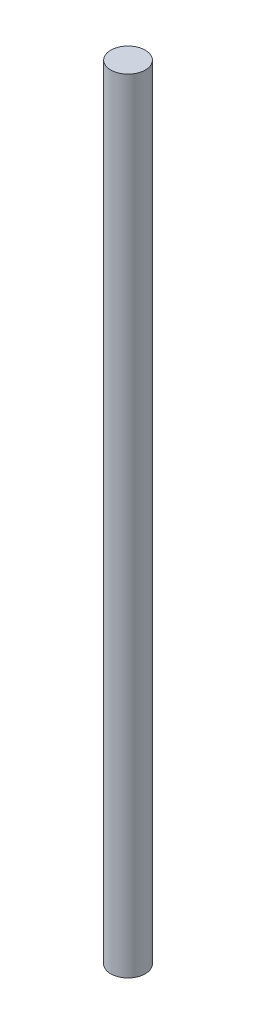
ISO-10303-21;
HEADER;
FILE_DESCRIPTION(('STEP AP214'),'2;1');
FILE_NAME('part.step','',(''),(''),'','','');
FILE_SCHEMA(('AUTOMOTIVE_DESIGN { 1 0 10303 214 1 1 1 1 }'));
ENDSEC;
DATA;
#1=APPLICATION_CONTEXT('core data for automotive mechanical design processes');
#2=APPLICATION_PROTOCOL_DEFINITION('international standard','automotive_design',2000,#1);
#3=PRODUCT_CONTEXT('',#1,'mechanical');
#4=PRODUCT('Part','Part','',(#3));
#5=PRODUCT_RELATED_PRODUCT_CATEGORY('part','',(#4));
#6=PRODUCT_DEFINITION_FORMATION('','',#4);
#7=PRODUCT_DEFINITION_CONTEXT('part definition',#1,'design');
#8=PRODUCT_DEFINITION('design','',#6,#7);
#9=PRODUCT_DEFINITION_SHAPE('','',#8);
#10=(LENGTH_UNIT() NAMED_UNIT(*) SI_UNIT(.MILLI.,.METRE.));
#11=(NAMED_UNIT(*) PLANE_ANGLE_UNIT() SI_UNIT($,.RADIAN.));
#12=(NAMED_UNIT(*) SI_UNIT($,.STERADIAN.) SOLID_ANGLE_UNIT());
#13=UNCERTAINTY_MEASURE_WITH_UNIT(LENGTH_MEASURE(1.E-05),#10,'distance_accuracy_value','');
#14=(GEOMETRIC_REPRESENTATION_CONTEXT(3) GLOBAL_UNCERTAINTY_ASSIGNED_CONTEXT((#13)) GLOBAL_UNIT_ASSIGNED_CONTEXT((#10,
#11,#12)) REPRESENTATION_CONTEXT('',''));
#15=CARTESIAN_POINT('',(0.,0.,0.));
#16=DIRECTION('',(0.,0.,1.));
#17=DIRECTION('',(1.,0.,0.));
#18=AXIS2_PLACEMENT_3D('',#15,#16,#17);
#19=CARTESIAN_POINT('',(0.,0.,0.));
#20=DIRECTION('',(0.,1.,0.));
#21=DIRECTION('',(0.,0.,1.));
#22=AXIS2_PLACEMENT_3D('',#19,#20,#21);
#23=PLANE('',#22);
#24=CARTESIAN_POINT('',(0.,0.,0.));
#25=DIRECTION('',(0.,-1.,0.));
#26=DIRECTION('',(0.,0.,-1.));
#27=AXIS2_PLACEMENT_3D('',#24,#25,#26);
#28=CIRCLE('',#27,1.3);
#29=CARTESIAN_POINT('',(0.,0.,-1.3));
#30=VERTEX_POINT('',#29);
#31=EDGE_CURVE('E10',#30,#30,#28,.T.);
#32=ORIENTED_EDGE('',*,*,#31,.F.);
#33=EDGE_LOOP('',(#32));
#34=FACE_BOUND('',#33,.T.);
#35=ADVANCED_FACE('F31',(#34),#23,.T.);
#36=CARTESIAN_POINT('',(0.,-63.,0.));
#37=DIRECTION('',(0.,-1.,0.));
#38=DIRECTION('',(0.,0.,-1.));
#39=AXIS2_PLACEMENT_3D('',#36,#37,#38);
#40=CYLINDRICAL_SURFACE('',#39,1.3);
#41=ORIENTED_EDGE('',*,*,#31,.T.);
#42=EDGE_LOOP('',(#41));
#43=FACE_BOUND('',#42,.T.);
#44=CARTESIAN_POINT('',(0.,-59.,0.));
#45=DIRECTION('',(0.,-1.,0.));
#46=DIRECTION('',(0.,0.,-1.));
#47=AXIS2_PLACEMENT_3D('',#44,#45,#46);
#48=CIRCLE('',#47,1.3);
#49=CARTESIAN_POINT('',(0.,-59.,-1.3));
#50=VERTEX_POINT('',#49);
#51=EDGE_CURVE('E37',#50,#50,#48,.T.);
#52=ORIENTED_EDGE('',*,*,#51,.F.);
#53=EDGE_LOOP('',(#52));
#54=FACE_BOUND('',#53,.T.);
#55=ADVANCED_FACE('F45',(#43,#54),#40,.T.);
#56=CARTESIAN_POINT('',(1.3,-59.,0.));
#57=DIRECTION('',(0.,-1.,0.));
#58=DIRECTION('',(0.,0.,-1.));
#59=AXIS2_PLACEMENT_3D('',#56,#57,#58);
#60=PLANE('',#59);
#61=ORIENTED_EDGE('',*,*,#51,.T.);
#62=EDGE_LOOP('',(#61));
#63=FACE_BOUND('',#62,.T.);
#64=ADVANCED_FACE('F43',(#63),#60,.T.);
#65=CLOSED_SHELL('',(#35,#55,#64));
#66=MANIFOLD_SOLID_BREP('B2',#65);
#67=ADVANCED_BREP_SHAPE_REPRESENTATION('',(#18,#66),#14);
#68=SHAPE_DEFINITION_REPRESENTATION(#9,#67);
ENDSEC;
END-ISO-10303-21;
